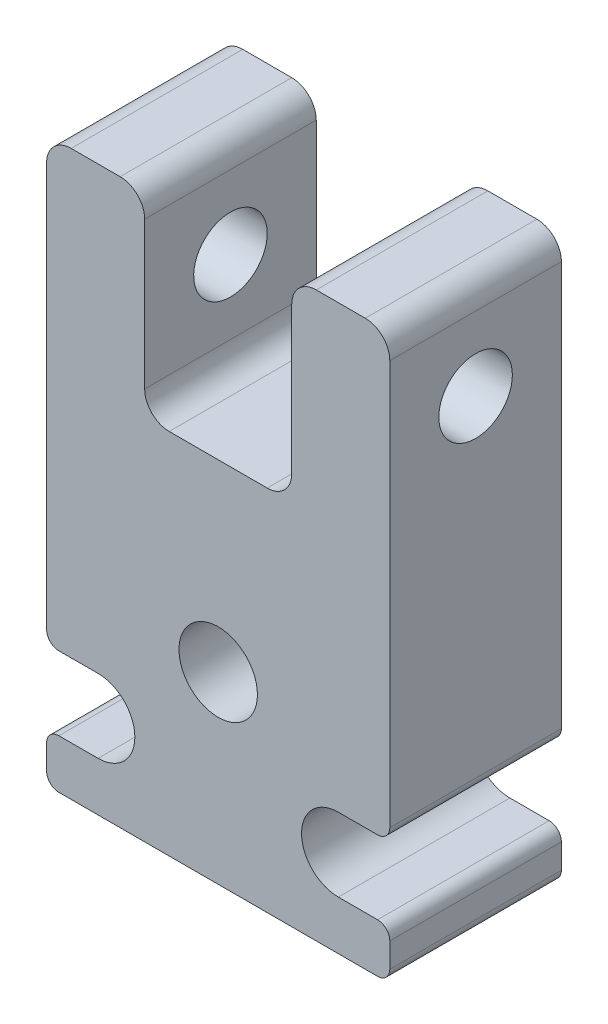
ISO-10303-21;
HEADER;
FILE_DESCRIPTION(('STEP AP214'),'2;1');
FILE_NAME('part.step','',(''),(''),'','','');
FILE_SCHEMA(('AUTOMOTIVE_DESIGN { 1 0 10303 214 1 1 1 1 }'));
ENDSEC;
DATA;
#1=APPLICATION_CONTEXT('core data for automotive mechanical design processes');
#2=APPLICATION_PROTOCOL_DEFINITION('international standard','automotive_design',2000,#1);
#3=PRODUCT_CONTEXT('',#1,'mechanical');
#4=PRODUCT('Part','Part','',(#3));
#5=PRODUCT_RELATED_PRODUCT_CATEGORY('part','',(#4));
#6=PRODUCT_DEFINITION_FORMATION('','',#4);
#7=PRODUCT_DEFINITION_CONTEXT('part definition',#1,'design');
#8=PRODUCT_DEFINITION('design','',#6,#7);
#9=PRODUCT_DEFINITION_SHAPE('','',#8);
#10=(LENGTH_UNIT() NAMED_UNIT(*) SI_UNIT(.MILLI.,.METRE.));
#11=(NAMED_UNIT(*) PLANE_ANGLE_UNIT() SI_UNIT($,.RADIAN.));
#12=(NAMED_UNIT(*) SI_UNIT($,.STERADIAN.) SOLID_ANGLE_UNIT());
#13=UNCERTAINTY_MEASURE_WITH_UNIT(LENGTH_MEASURE(1.E-05),#10,'distance_accuracy_value','');
#14=(GEOMETRIC_REPRESENTATION_CONTEXT(3) GLOBAL_UNCERTAINTY_ASSIGNED_CONTEXT((#13)) GLOBAL_UNIT_ASSIGNED_CONTEXT((#10,
#11,#12)) REPRESENTATION_CONTEXT('',''));
#15=CARTESIAN_POINT('',(0.,0.,0.));
#16=DIRECTION('',(0.,0.,1.));
#17=DIRECTION('',(1.,0.,0.));
#18=AXIS2_PLACEMENT_3D('',#15,#16,#17);
#19=CARTESIAN_POINT('',(-4.9,-8.00000000000001,3.5));
#20=DIRECTION('',(0.,0.,1.));
#21=DIRECTION('',(1.,0.,0.));
#22=AXIS2_PLACEMENT_3D('',#19,#20,#21);
#23=PLANE('',#22);
#24=DIRECTION('',(1.,0.,0.));
#25=VECTOR('',#24,1.);
#26=CARTESIAN_POINT('',(-7.,-11.5,3.5));
#27=LINE('',#26,#25);
#28=CARTESIAN_POINT('',(-6.5,-11.5,3.5));
#29=VERTEX_POINT('',#28);
#30=CARTESIAN_POINT('',(6.5,-11.5,3.5));
#31=VERTEX_POINT('',#30);
#32=EDGE_CURVE('E279',#29,#31,#27,.T.);
#33=ORIENTED_EDGE('',*,*,#32,.T.);
#34=CARTESIAN_POINT('',(6.5,-11.,3.5));
#35=DIRECTION('',(0.,0.,1.));
#36=DIRECTION('',(1.,0.,0.));
#37=AXIS2_PLACEMENT_3D('',#34,#35,#36);
#38=CIRCLE('',#37,0.5);
#39=CARTESIAN_POINT('',(7.,-11.,3.5));
#40=VERTEX_POINT('',#39);
#41=EDGE_CURVE('E415',#31,#40,#38,.T.);
#42=ORIENTED_EDGE('',*,*,#41,.T.);
#43=DIRECTION('',(0.,1.,0.));
#44=VECTOR('',#43,1.);
#45=CARTESIAN_POINT('',(7.,-9.50000000000001,3.5));
#46=LINE('',#45,#44);
#47=CARTESIAN_POINT('',(7.,-10.,3.5));
#48=VERTEX_POINT('',#47);
#49=EDGE_CURVE('E230',#40,#48,#46,.T.);
#50=ORIENTED_EDGE('',*,*,#49,.T.);
#51=CARTESIAN_POINT('',(6.5,-10.,3.5));
#52=DIRECTION('',(0.,0.,1.));
#53=DIRECTION('',(1.,0.,0.));
#54=AXIS2_PLACEMENT_3D('',#51,#52,#53);
#55=CIRCLE('',#54,0.5);
#56=CARTESIAN_POINT('',(6.5,-9.50000000000001,3.5));
#57=VERTEX_POINT('',#56);
#58=EDGE_CURVE('E226',#48,#57,#55,.T.);
#59=ORIENTED_EDGE('',*,*,#58,.T.);
#60=DIRECTION('',(-1.,0.,0.));
#61=VECTOR('',#60,1.);
#62=CARTESIAN_POINT('',(4.9,-9.50000000000001,3.5));
#63=LINE('',#62,#61);
#64=CARTESIAN_POINT('',(4.9,-9.50000000000001,3.5));
#65=VERTEX_POINT('',#64);
#66=EDGE_CURVE('E217',#57,#65,#63,.T.);
#67=ORIENTED_EDGE('',*,*,#66,.T.);
#68=CARTESIAN_POINT('',(4.9,-8.,3.5));
#69=DIRECTION('',(0.,0.,-1.));
#70=DIRECTION('',(1.,0.,0.));
#71=AXIS2_PLACEMENT_3D('',#68,#69,#70);
#72=CIRCLE('',#71,1.5);
#73=CARTESIAN_POINT('',(4.9,-6.5,3.5));
#74=VERTEX_POINT('',#73);
#75=EDGE_CURVE('E222',#65,#74,#72,.T.);
#76=ORIENTED_EDGE('',*,*,#75,.T.);
#77=DIRECTION('',(1.,0.,0.));
#78=VECTOR('',#77,1.);
#79=CARTESIAN_POINT('',(4.9,-6.5,3.5));
#80=LINE('',#79,#78);
#81=CARTESIAN_POINT('',(6.5,-6.50000000000001,3.5));
#82=VERTEX_POINT('',#81);
#83=EDGE_CURVE('E244',#74,#82,#80,.T.);
#84=ORIENTED_EDGE('',*,*,#83,.T.);
#85=CARTESIAN_POINT('',(6.5,-6.00000000000001,3.5));
#86=DIRECTION('',(0.,0.,1.));
#87=DIRECTION('',(1.,0.,0.));
#88=AXIS2_PLACEMENT_3D('',#85,#86,#87);
#89=CIRCLE('',#88,0.5);
#90=CARTESIAN_POINT('',(7.,-6.00000000000001,3.5));
#91=VERTEX_POINT('',#90);
#92=EDGE_CURVE('E48',#82,#91,#89,.T.);
#93=ORIENTED_EDGE('',*,*,#92,.T.);
#94=DIRECTION('',(0.,1.,0.));
#95=VECTOR('',#94,1.);
#96=CARTESIAN_POINT('',(7.,11.5,3.5));
#97=LINE('',#96,#95);
#98=CARTESIAN_POINT('',(7.,10.5,3.5));
#99=VERTEX_POINT('',#98);
#100=EDGE_CURVE('E246',#91,#99,#97,.T.);
#101=ORIENTED_EDGE('',*,*,#100,.T.);
#102=CARTESIAN_POINT('',(6.,10.5,3.5));
#103=DIRECTION('',(0.,0.,1.));
#104=DIRECTION('',(1.,0.,0.));
#105=AXIS2_PLACEMENT_3D('',#102,#103,#104);
#106=CIRCLE('',#105,1.);
#107=CARTESIAN_POINT('',(6.,11.5,3.5));
#108=VERTEX_POINT('',#107);
#109=EDGE_CURVE('E346',#99,#108,#106,.T.);
#110=ORIENTED_EDGE('',*,*,#109,.T.);
#111=DIRECTION('',(-1.,0.,0.));
#112=VECTOR('',#111,1.);
#113=CARTESIAN_POINT('',(3.,11.5,3.5));
#114=LINE('',#113,#112);
#115=CARTESIAN_POINT('',(4.,11.5,3.5));
#116=VERTEX_POINT('',#115);
#117=EDGE_CURVE('E251',#108,#116,#114,.T.);
#118=ORIENTED_EDGE('',*,*,#117,.T.);
#119=CARTESIAN_POINT('',(4.,10.5,3.5));
#120=DIRECTION('',(0.,0.,1.));
#121=DIRECTION('',(1.,0.,0.));
#122=AXIS2_PLACEMENT_3D('',#119,#120,#121);
#123=CIRCLE('',#122,1.);
#124=CARTESIAN_POINT('',(3.,10.5,3.5));
#125=VERTEX_POINT('',#124);
#126=EDGE_CURVE('E348',#116,#125,#123,.T.);
#127=ORIENTED_EDGE('',*,*,#126,.T.);
#128=DIRECTION('',(0.,-1.,0.));
#129=VECTOR('',#128,1.);
#130=CARTESIAN_POINT('',(3.,11.5,3.5));
#131=LINE('',#130,#129);
#132=CARTESIAN_POINT('',(3.,4.5,3.5));
#133=VERTEX_POINT('',#132);
#134=EDGE_CURVE('E254',#125,#133,#131,.T.);
#135=ORIENTED_EDGE('',*,*,#134,.T.);
#136=CARTESIAN_POINT('',(2.,4.5,3.5));
#137=DIRECTION('',(0.,0.,1.));
#138=DIRECTION('',(1.,0.,0.));
#139=AXIS2_PLACEMENT_3D('',#136,#137,#138);
#140=CIRCLE('',#139,1.);
#141=CARTESIAN_POINT('',(2.,3.5,3.5));
#142=VERTEX_POINT('',#141);
#143=EDGE_CURVE('E383',#133,#142,#140,.F.);
#144=ORIENTED_EDGE('',*,*,#143,.T.);
#145=DIRECTION('',(-1.,0.,0.));
#146=VECTOR('',#145,1.);
#147=CARTESIAN_POINT('',(-3.,3.5,3.5));
#148=LINE('',#147,#146);
#149=CARTESIAN_POINT('',(-2.,3.5,3.5));
#150=VERTEX_POINT('',#149);
#151=EDGE_CURVE('E257',#142,#150,#148,.T.);
#152=ORIENTED_EDGE('',*,*,#151,.T.);
#153=CARTESIAN_POINT('',(-2.,4.5,3.5));
#154=DIRECTION('',(0.,0.,1.));
#155=DIRECTION('',(1.,0.,0.));
#156=AXIS2_PLACEMENT_3D('',#153,#154,#155);
#157=CIRCLE('',#156,1.);
#158=CARTESIAN_POINT('',(-3.,4.5,3.5));
#159=VERTEX_POINT('',#158);
#160=EDGE_CURVE('E379',#150,#159,#157,.F.);
#161=ORIENTED_EDGE('',*,*,#160,.T.);
#162=DIRECTION('',(0.,1.,0.));
#163=VECTOR('',#162,1.);
#164=CARTESIAN_POINT('',(-3.,11.5,3.5));
#165=LINE('',#164,#163);
#166=CARTESIAN_POINT('',(-3.,10.5,3.5));
#167=VERTEX_POINT('',#166);
#168=EDGE_CURVE('E260',#159,#167,#165,.T.);
#169=ORIENTED_EDGE('',*,*,#168,.T.);
#170=CARTESIAN_POINT('',(-4.,10.5,3.5));
#171=DIRECTION('',(0.,0.,1.));
#172=DIRECTION('',(1.,0.,0.));
#173=AXIS2_PLACEMENT_3D('',#170,#171,#172);
#174=CIRCLE('',#173,1.);
#175=CARTESIAN_POINT('',(-4.,11.5,3.5));
#176=VERTEX_POINT('',#175);
#177=EDGE_CURVE('E350',#167,#176,#174,.T.);
#178=ORIENTED_EDGE('',*,*,#177,.T.);
#179=DIRECTION('',(-1.,0.,0.));
#180=VECTOR('',#179,1.);
#181=CARTESIAN_POINT('',(-7.,11.5,3.5));
#182=LINE('',#181,#180);
#183=CARTESIAN_POINT('',(-6.,11.5,3.5));
#184=VERTEX_POINT('',#183);
#185=EDGE_CURVE('E263',#176,#184,#182,.T.);
#186=ORIENTED_EDGE('',*,*,#185,.T.);
#187=CARTESIAN_POINT('',(-6.,10.5,3.5));
#188=DIRECTION('',(0.,0.,1.));
#189=DIRECTION('',(1.,0.,0.));
#190=AXIS2_PLACEMENT_3D('',#187,#188,#189);
#191=CIRCLE('',#190,1.);
#192=CARTESIAN_POINT('',(-7.,10.5,3.5));
#193=VERTEX_POINT('',#192);
#194=EDGE_CURVE('E352',#184,#193,#191,.T.);
#195=ORIENTED_EDGE('',*,*,#194,.T.);
#196=DIRECTION('',(0.,-1.,0.));
#197=VECTOR('',#196,1.);
#198=CARTESIAN_POINT('',(-7.,11.5,3.5));
#199=LINE('',#198,#197);
#200=CARTESIAN_POINT('',(-7.,-6.00000000000001,3.5));
#201=VERTEX_POINT('',#200);
#202=EDGE_CURVE('E266',#193,#201,#199,.T.);
#203=ORIENTED_EDGE('',*,*,#202,.T.);
#204=CARTESIAN_POINT('',(-6.5,-6.00000000000001,3.5));
#205=DIRECTION('',(0.,0.,1.));
#206=DIRECTION('',(1.,0.,0.));
#207=AXIS2_PLACEMENT_3D('',#204,#205,#206);
#208=CIRCLE('',#207,0.5);
#209=CARTESIAN_POINT('',(-6.5,-6.50000000000001,3.5));
#210=VERTEX_POINT('',#209);
#211=EDGE_CURVE('E407',#201,#210,#208,.T.);
#212=ORIENTED_EDGE('',*,*,#211,.T.);
#213=DIRECTION('',(1.,0.,0.));
#214=VECTOR('',#213,1.);
#215=CARTESIAN_POINT('',(-4.9,-6.5,3.5));
#216=LINE('',#215,#214);
#217=CARTESIAN_POINT('',(-4.9,-6.5,3.5));
#218=VERTEX_POINT('',#217);
#219=EDGE_CURVE('E269',#210,#218,#216,.T.);
#220=ORIENTED_EDGE('',*,*,#219,.T.);
#221=CARTESIAN_POINT('',(-4.9,-8.00000000000001,3.5));
#222=DIRECTION('',(0.,0.,-1.));
#223=DIRECTION('',(1.,0.,0.));
#224=AXIS2_PLACEMENT_3D('',#221,#222,#223);
#225=CIRCLE('',#224,1.5);
#226=CARTESIAN_POINT('',(-4.9,-9.50000000000001,3.5));
#227=VERTEX_POINT('',#226);
#228=EDGE_CURVE('E271',#218,#227,#225,.T.);
#229=ORIENTED_EDGE('',*,*,#228,.T.);
#230=DIRECTION('',(-1.,0.,0.));
#231=VECTOR('',#230,1.);
#232=CARTESIAN_POINT('',(-4.9,-9.50000000000001,3.5));
#233=LINE('',#232,#231);
#234=CARTESIAN_POINT('',(-6.5,-9.50000000000001,3.5));
#235=VERTEX_POINT('',#234);
#236=EDGE_CURVE('E273',#227,#235,#233,.T.);
#237=ORIENTED_EDGE('',*,*,#236,.T.);
#238=CARTESIAN_POINT('',(-6.5,-10.,3.5));
#239=DIRECTION('',(0.,0.,1.));
#240=DIRECTION('',(1.,0.,0.));
#241=AXIS2_PLACEMENT_3D('',#238,#239,#240);
#242=CIRCLE('',#241,0.5);
#243=CARTESIAN_POINT('',(-7.,-10.,3.5));
#244=VERTEX_POINT('',#243);
#245=EDGE_CURVE('E409',#235,#244,#242,.T.);
#246=ORIENTED_EDGE('',*,*,#245,.T.);
#247=DIRECTION('',(0.,-1.,0.));
#248=VECTOR('',#247,1.);
#249=CARTESIAN_POINT('',(-7.,-9.50000000000001,3.5));
#250=LINE('',#249,#248);
#251=CARTESIAN_POINT('',(-7.,-11.,3.5));
#252=VERTEX_POINT('',#251);
#253=EDGE_CURVE('E276',#244,#252,#250,.T.);
#254=ORIENTED_EDGE('',*,*,#253,.T.);
#255=CARTESIAN_POINT('',(-6.5,-11.,3.5));
#256=DIRECTION('',(0.,0.,1.));
#257=DIRECTION('',(1.,0.,0.));
#258=AXIS2_PLACEMENT_3D('',#255,#256,#257);
#259=CIRCLE('',#258,0.5);
#260=EDGE_CURVE('E413',#252,#29,#259,.T.);
#261=ORIENTED_EDGE('',*,*,#260,.T.);
#262=EDGE_LOOP('',(#33,#42,#50,#59,#67,#76,#84,#93,#101,#110,#118,#127,#135,#144,#152,#161,#169,
#178,#186,#195,#203,#212,#220,#229,#237,#246,#254,#261));
#263=FACE_BOUND('',#262,.T.);
#264=CARTESIAN_POINT('',(0.,-4.,3.5));
#265=DIRECTION('',(0.,0.,1.));
#266=DIRECTION('',(1.,0.,0.));
#267=AXIS2_PLACEMENT_3D('',#264,#265,#266);
#268=CIRCLE('',#267,1.6);
#269=CARTESIAN_POINT('',(1.6,-4.,3.5));
#270=VERTEX_POINT('',#269);
#271=EDGE_CURVE('E285',#270,#270,#268,.T.);
#272=ORIENTED_EDGE('',*,*,#271,.F.);
#273=EDGE_LOOP('',(#272));
#274=FACE_BOUND('',#273,.T.);
#275=ADVANCED_FACE('F33',(#263,#274),#23,.T.);
#276=CARTESIAN_POINT('',(-4.9,-8.00000000000001,-3.5));
#277=DIRECTION('',(0.,0.,1.));
#278=DIRECTION('',(1.,0.,0.));
#279=AXIS2_PLACEMENT_3D('',#276,#277,#278);
#280=PLANE('',#279);
#281=DIRECTION('',(0.,1.,0.));
#282=VECTOR('',#281,1.);
#283=CARTESIAN_POINT('',(7.,-9.50000000000001,-3.5));
#284=LINE('',#283,#282);
#285=CARTESIAN_POINT('',(7.,-11.,-3.5));
#286=VERTEX_POINT('',#285);
#287=CARTESIAN_POINT('',(7.,-10.,-3.5));
#288=VERTEX_POINT('',#287);
#289=EDGE_CURVE('E282',#286,#288,#284,.T.);
#290=ORIENTED_EDGE('',*,*,#289,.F.);
#291=CARTESIAN_POINT('',(6.5,-11.,-3.5));
#292=DIRECTION('',(0.,0.,1.));
#293=DIRECTION('',(1.,0.,0.));
#294=AXIS2_PLACEMENT_3D('',#291,#292,#293);
#295=CIRCLE('',#294,0.5);
#296=CARTESIAN_POINT('',(6.5,-11.5,-3.5));
#297=VERTEX_POINT('',#296);
#298=EDGE_CURVE('E400',#286,#297,#295,.F.);
#299=ORIENTED_EDGE('',*,*,#298,.T.);
#300=DIRECTION('',(1.,0.,0.));
#301=VECTOR('',#300,1.);
#302=CARTESIAN_POINT('',(-7.,-11.5,-3.5));
#303=LINE('',#302,#301);
#304=CARTESIAN_POINT('',(-6.5,-11.5,-3.5));
#305=VERTEX_POINT('',#304);
#306=EDGE_CURVE('E321',#305,#297,#303,.T.);
#307=ORIENTED_EDGE('',*,*,#306,.F.);
#308=CARTESIAN_POINT('',(-6.5,-11.,-3.5));
#309=DIRECTION('',(0.,0.,1.));
#310=DIRECTION('',(1.,0.,0.));
#311=AXIS2_PLACEMENT_3D('',#308,#309,#310);
#312=CIRCLE('',#311,0.5);
#313=CARTESIAN_POINT('',(-7.,-11.,-3.5));
#314=VERTEX_POINT('',#313);
#315=EDGE_CURVE('E398',#305,#314,#312,.F.);
#316=ORIENTED_EDGE('',*,*,#315,.T.);
#317=DIRECTION('',(0.,-1.,0.));
#318=VECTOR('',#317,1.);
#319=CARTESIAN_POINT('',(-7.,-9.50000000000001,-3.5));
#320=LINE('',#319,#318);
#321=CARTESIAN_POINT('',(-7.,-10.,-3.5));
#322=VERTEX_POINT('',#321);
#323=EDGE_CURVE('E318',#322,#314,#320,.T.);
#324=ORIENTED_EDGE('',*,*,#323,.F.);
#325=CARTESIAN_POINT('',(-6.5,-10.,-3.5));
#326=DIRECTION('',(0.,0.,1.));
#327=DIRECTION('',(1.,0.,0.));
#328=AXIS2_PLACEMENT_3D('',#325,#326,#327);
#329=CIRCLE('',#328,0.5);
#330=CARTESIAN_POINT('',(-6.5,-9.50000000000001,-3.5));
#331=VERTEX_POINT('',#330);
#332=EDGE_CURVE('E392',#322,#331,#329,.F.);
#333=ORIENTED_EDGE('',*,*,#332,.T.);
#334=DIRECTION('',(-1.,0.,0.));
#335=VECTOR('',#334,1.);
#336=CARTESIAN_POINT('',(-4.9,-9.50000000000001,-3.5));
#337=LINE('',#336,#335);
#338=CARTESIAN_POINT('',(-4.9,-9.50000000000001,-3.5));
#339=VERTEX_POINT('',#338);
#340=EDGE_CURVE('E315',#339,#331,#337,.T.);
#341=ORIENTED_EDGE('',*,*,#340,.F.);
#342=CARTESIAN_POINT('',(-4.9,-8.00000000000001,-3.5));
#343=DIRECTION('',(0.,0.,-1.));
#344=DIRECTION('',(1.,0.,0.));
#345=AXIS2_PLACEMENT_3D('',#342,#343,#344);
#346=CIRCLE('',#345,1.5);
#347=CARTESIAN_POINT('',(-4.9,-6.5,-3.5));
#348=VERTEX_POINT('',#347);
#349=EDGE_CURVE('E313',#348,#339,#346,.T.);
#350=ORIENTED_EDGE('',*,*,#349,.F.);
#351=DIRECTION('',(1.,0.,0.));
#352=VECTOR('',#351,1.);
#353=CARTESIAN_POINT('',(-4.9,-6.5,-3.5));
#354=LINE('',#353,#352);
#355=CARTESIAN_POINT('',(-6.5,-6.50000000000001,-3.5));
#356=VERTEX_POINT('',#355);
#357=EDGE_CURVE('E311',#356,#348,#354,.T.);
#358=ORIENTED_EDGE('',*,*,#357,.F.);
#359=CARTESIAN_POINT('',(-6.5,-6.00000000000001,-3.5));
#360=DIRECTION('',(0.,0.,1.));
#361=DIRECTION('',(1.,0.,0.));
#362=AXIS2_PLACEMENT_3D('',#359,#360,#361);
#363=CIRCLE('',#362,0.5);
#364=CARTESIAN_POINT('',(-7.,-6.00000000000001,-3.5));
#365=VERTEX_POINT('',#364);
#366=EDGE_CURVE('E390',#356,#365,#363,.F.);
#367=ORIENTED_EDGE('',*,*,#366,.T.);
#368=DIRECTION('',(0.,-1.,0.));
#369=VECTOR('',#368,1.);
#370=CARTESIAN_POINT('',(-7.,11.5,-3.5));
#371=LINE('',#370,#369);
#372=CARTESIAN_POINT('',(-7.,10.5,-3.5));
#373=VERTEX_POINT('',#372);
#374=EDGE_CURVE('E308',#373,#365,#371,.T.);
#375=ORIENTED_EDGE('',*,*,#374,.F.);
#376=CARTESIAN_POINT('',(-6.,10.5,-3.5));
#377=DIRECTION('',(0.,0.,1.));
#378=DIRECTION('',(1.,0.,0.));
#379=AXIS2_PLACEMENT_3D('',#376,#377,#378);
#380=CIRCLE('',#379,1.);
#381=CARTESIAN_POINT('',(-6.,11.5,-3.5));
#382=VERTEX_POINT('',#381);
#383=EDGE_CURVE('E339',#373,#382,#380,.F.);
#384=ORIENTED_EDGE('',*,*,#383,.T.);
#385=DIRECTION('',(-1.,0.,0.));
#386=VECTOR('',#385,1.);
#387=CARTESIAN_POINT('',(-7.,11.5,-3.5));
#388=LINE('',#387,#386);
#389=CARTESIAN_POINT('',(-4.,11.5,-3.5));
#390=VERTEX_POINT('',#389);
#391=EDGE_CURVE('E305',#390,#382,#388,.T.);
#392=ORIENTED_EDGE('',*,*,#391,.F.);
#393=CARTESIAN_POINT('',(-4.,10.5,-3.5));
#394=DIRECTION('',(0.,0.,1.));
#395=DIRECTION('',(1.,0.,0.));
#396=AXIS2_PLACEMENT_3D('',#393,#394,#395);
#397=CIRCLE('',#396,1.);
#398=CARTESIAN_POINT('',(-3.,10.5,-3.5));
#399=VERTEX_POINT('',#398);
#400=EDGE_CURVE('E337',#390,#399,#397,.F.);
#401=ORIENTED_EDGE('',*,*,#400,.T.);
#402=DIRECTION('',(0.,1.,0.));
#403=VECTOR('',#402,1.);
#404=CARTESIAN_POINT('',(-3.,11.5,-3.5));
#405=LINE('',#404,#403);
#406=CARTESIAN_POINT('',(-3.,4.5,-3.5));
#407=VERTEX_POINT('',#406);
#408=EDGE_CURVE('E302',#407,#399,#405,.T.);
#409=ORIENTED_EDGE('',*,*,#408,.F.);
#410=CARTESIAN_POINT('',(-2.,4.5,-3.5));
#411=DIRECTION('',(0.,0.,1.));
#412=DIRECTION('',(1.,0.,0.));
#413=AXIS2_PLACEMENT_3D('',#410,#411,#412);
#414=CIRCLE('',#413,1.);
#415=CARTESIAN_POINT('',(-2.,3.5,-3.5));
#416=VERTEX_POINT('',#415);
#417=EDGE_CURVE('E377',#407,#416,#414,.T.);
#418=ORIENTED_EDGE('',*,*,#417,.T.);
#419=DIRECTION('',(-1.,0.,0.));
#420=VECTOR('',#419,1.);
#421=CARTESIAN_POINT('',(-3.,3.5,-3.5));
#422=LINE('',#421,#420);
#423=CARTESIAN_POINT('',(2.,3.5,-3.5));
#424=VERTEX_POINT('',#423);
#425=EDGE_CURVE('E299',#424,#416,#422,.T.);
#426=ORIENTED_EDGE('',*,*,#425,.F.);
#427=CARTESIAN_POINT('',(2.,4.5,-3.5));
#428=DIRECTION('',(0.,0.,1.));
#429=DIRECTION('',(1.,0.,0.));
#430=AXIS2_PLACEMENT_3D('',#427,#428,#429);
#431=CIRCLE('',#430,1.);
#432=CARTESIAN_POINT('',(3.,4.5,-3.5));
#433=VERTEX_POINT('',#432);
#434=EDGE_CURVE('E381',#424,#433,#431,.T.);
#435=ORIENTED_EDGE('',*,*,#434,.T.);
#436=DIRECTION('',(0.,-1.,0.));
#437=VECTOR('',#436,1.);
#438=CARTESIAN_POINT('',(3.,11.5,-3.5));
#439=LINE('',#438,#437);
#440=CARTESIAN_POINT('',(3.,10.5,-3.5));
#441=VERTEX_POINT('',#440);
#442=EDGE_CURVE('E296',#441,#433,#439,.T.);
#443=ORIENTED_EDGE('',*,*,#442,.F.);
#444=CARTESIAN_POINT('',(4.,10.5,-3.5));
#445=DIRECTION('',(0.,0.,1.));
#446=DIRECTION('',(1.,0.,0.));
#447=AXIS2_PLACEMENT_3D('',#444,#445,#446);
#448=CIRCLE('',#447,1.);
#449=CARTESIAN_POINT('',(4.,11.5,-3.5));
#450=VERTEX_POINT('',#449);
#451=EDGE_CURVE('E335',#441,#450,#448,.F.);
#452=ORIENTED_EDGE('',*,*,#451,.T.);
#453=DIRECTION('',(-1.,0.,0.));
#454=VECTOR('',#453,1.);
#455=CARTESIAN_POINT('',(3.,11.5,-3.5));
#456=LINE('',#455,#454);
#457=CARTESIAN_POINT('',(6.,11.5,-3.5));
#458=VERTEX_POINT('',#457);
#459=EDGE_CURVE('E293',#458,#450,#456,.T.);
#460=ORIENTED_EDGE('',*,*,#459,.F.);
#461=CARTESIAN_POINT('',(6.,10.5,-3.5));
#462=DIRECTION('',(0.,0.,1.));
#463=DIRECTION('',(1.,0.,0.));
#464=AXIS2_PLACEMENT_3D('',#461,#462,#463);
#465=CIRCLE('',#464,1.);
#466=CARTESIAN_POINT('',(7.,10.5,-3.5));
#467=VERTEX_POINT('',#466);
#468=EDGE_CURVE('E332',#458,#467,#465,.F.);
#469=ORIENTED_EDGE('',*,*,#468,.T.);
#470=DIRECTION('',(0.,1.,0.));
#471=VECTOR('',#470,1.);
#472=CARTESIAN_POINT('',(7.,11.5,-3.5));
#473=LINE('',#472,#471);
#474=CARTESIAN_POINT('',(7.,-6.00000000000001,-3.5));
#475=VERTEX_POINT('',#474);
#476=EDGE_CURVE('E291',#475,#467,#473,.T.);
#477=ORIENTED_EDGE('',*,*,#476,.F.);
#478=CARTESIAN_POINT('',(6.5,-6.00000000000001,-3.5));
#479=DIRECTION('',(0.,0.,1.));
#480=DIRECTION('',(1.,0.,0.));
#481=AXIS2_PLACEMENT_3D('',#478,#479,#480);
#482=CIRCLE('',#481,0.5);
#483=CARTESIAN_POINT('',(6.5,-6.50000000000001,-3.5));
#484=VERTEX_POINT('',#483);
#485=EDGE_CURVE('E394',#475,#484,#482,.F.);
#486=ORIENTED_EDGE('',*,*,#485,.T.);
#487=DIRECTION('',(1.,0.,0.));
#488=VECTOR('',#487,1.);
#489=CARTESIAN_POINT('',(4.9,-6.5,-3.5));
#490=LINE('',#489,#488);
#491=CARTESIAN_POINT('',(4.9,-6.5,-3.5));
#492=VERTEX_POINT('',#491);
#493=EDGE_CURVE('E289',#492,#484,#490,.T.);
#494=ORIENTED_EDGE('',*,*,#493,.F.);
#495=CARTESIAN_POINT('',(4.9,-8.,-3.5));
#496=DIRECTION('',(0.,0.,-1.));
#497=DIRECTION('',(1.,0.,0.));
#498=AXIS2_PLACEMENT_3D('',#495,#496,#497);
#499=CIRCLE('',#498,1.5);
#500=CARTESIAN_POINT('',(4.9,-9.50000000000001,-3.5));
#501=VERTEX_POINT('',#500);
#502=EDGE_CURVE('E287',#501,#492,#499,.T.);
#503=ORIENTED_EDGE('',*,*,#502,.F.);
#504=DIRECTION('',(-1.,0.,0.));
#505=VECTOR('',#504,1.);
#506=CARTESIAN_POINT('',(4.9,-9.50000000000001,-3.5));
#507=LINE('',#506,#505);
#508=CARTESIAN_POINT('',(6.5,-9.50000000000001,-3.5));
#509=VERTEX_POINT('',#508);
#510=EDGE_CURVE('E236',#509,#501,#507,.T.);
#511=ORIENTED_EDGE('',*,*,#510,.F.);
#512=CARTESIAN_POINT('',(6.5,-10.,-3.5));
#513=DIRECTION('',(0.,0.,1.));
#514=DIRECTION('',(1.,0.,0.));
#515=AXIS2_PLACEMENT_3D('',#512,#513,#514);
#516=CIRCLE('',#515,0.5);
#517=EDGE_CURVE('E396',#509,#288,#516,.F.);
#518=ORIENTED_EDGE('',*,*,#517,.T.);
#519=EDGE_LOOP('',(#290,#299,#307,#316,#324,#333,#341,#350,#358,#367,#375,#384,#392,#401,#409,
#418,#426,#435,#443,#452,#460,#469,#477,#486,#494,#503,#511,#518));
#520=FACE_BOUND('',#519,.T.);
#521=CARTESIAN_POINT('',(0.,-4.,-3.5));
#522=DIRECTION('',(0.,0.,1.));
#523=DIRECTION('',(1.,0.,0.));
#524=AXIS2_PLACEMENT_3D('',#521,#522,#523);
#525=CIRCLE('',#524,1.6);
#526=CARTESIAN_POINT('',(1.6,-4.,-3.5));
#527=VERTEX_POINT('',#526);
#528=EDGE_CURVE('E482',#527,#527,#525,.T.);
#529=ORIENTED_EDGE('',*,*,#528,.T.);
#530=EDGE_LOOP('',(#529));
#531=FACE_BOUND('',#530,.T.);
#532=ADVANCED_FACE('F441',(#520,#531),#280,.F.);
#533=CARTESIAN_POINT('',(7.,-9.50000000000001,3.5));
#534=DIRECTION('',(-1.,0.,0.));
#535=DIRECTION('',(0.,-1.,0.));
#536=AXIS2_PLACEMENT_3D('',#533,#534,#535);
#537=PLANE('',#536);
#538=ORIENTED_EDGE('',*,*,#49,.F.);
#539=DIRECTION('',(0.,0.,-1.));
#540=VECTOR('',#539,1.);
#541=CARTESIAN_POINT('',(7.,-11.,3.5));
#542=LINE('',#541,#540);
#543=EDGE_CURVE('E387',#40,#286,#542,.T.);
#544=ORIENTED_EDGE('',*,*,#543,.T.);
#545=ORIENTED_EDGE('',*,*,#289,.T.);
#546=DIRECTION('',(0.,0.,-1.));
#547=VECTOR('',#546,1.);
#548=CARTESIAN_POINT('',(7.,-10.,3.5));
#549=LINE('',#548,#547);
#550=EDGE_CURVE('E385',#288,#48,#549,.F.);
#551=ORIENTED_EDGE('',*,*,#550,.T.);
#552=EDGE_LOOP('',(#538,#544,#545,#551));
#553=FACE_BOUND('',#552,.T.);
#554=ADVANCED_FACE('F477',(#553),#537,.F.);
#555=CARTESIAN_POINT('',(4.9,-9.50000000000001,3.5));
#556=DIRECTION('',(0.,-1.,0.));
#557=DIRECTION('',(1.,0.,0.));
#558=AXIS2_PLACEMENT_3D('',#555,#556,#557);
#559=PLANE('',#558);
#560=ORIENTED_EDGE('',*,*,#66,.F.);
#561=DIRECTION('',(0.,0.,-1.));
#562=VECTOR('',#561,1.);
#563=CARTESIAN_POINT('',(6.5,-9.50000000000001,3.5));
#564=LINE('',#563,#562);
#565=EDGE_CURVE('E422',#57,#509,#564,.T.);
#566=ORIENTED_EDGE('',*,*,#565,.T.);
#567=ORIENTED_EDGE('',*,*,#510,.T.);
#568=DIRECTION('',(0.,0.,-1.));
#569=VECTOR('',#568,1.);
#570=CARTESIAN_POINT('',(4.9,-9.50000000000001,3.5));
#571=LINE('',#570,#569);
#572=EDGE_CURVE('E233',#65,#501,#571,.T.);
#573=ORIENTED_EDGE('',*,*,#572,.F.);
#574=EDGE_LOOP('',(#560,#566,#567,#573));
#575=FACE_BOUND('',#574,.T.);
#576=ADVANCED_FACE('F234',(#575),#559,.F.);
#577=CARTESIAN_POINT('',(4.9,-8.,3.5));
#578=DIRECTION('',(0.,0.,-1.));
#579=DIRECTION('',(-1.,0.,0.));
#580=AXIS2_PLACEMENT_3D('',#577,#578,#579);
#581=CYLINDRICAL_SURFACE('',#580,1.5);
#582=ORIENTED_EDGE('',*,*,#502,.T.);
#583=DIRECTION('',(0.,0.,-1.));
#584=VECTOR('',#583,1.);
#585=CARTESIAN_POINT('',(4.9,-6.5,3.5));
#586=LINE('',#585,#584);
#587=EDGE_CURVE('E240',#74,#492,#586,.T.);
#588=ORIENTED_EDGE('',*,*,#587,.F.);
#589=ORIENTED_EDGE('',*,*,#75,.F.);
#590=ORIENTED_EDGE('',*,*,#572,.T.);
#591=EDGE_LOOP('',(#582,#588,#589,#590));
#592=FACE_BOUND('',#591,.T.);
#593=ADVANCED_FACE('F242',(#592),#581,.F.);
#594=CARTESIAN_POINT('',(4.9,-6.5,3.5));
#595=DIRECTION('',(0.,1.,0.));
#596=DIRECTION('',(-1.,0.,0.));
#597=AXIS2_PLACEMENT_3D('',#594,#595,#596);
#598=PLANE('',#597);
#599=ORIENTED_EDGE('',*,*,#493,.T.);
#600=DIRECTION('',(0.,0.,-1.));
#601=VECTOR('',#600,1.);
#602=CARTESIAN_POINT('',(6.5,-6.50000000000001,3.5));
#603=LINE('',#602,#601);
#604=EDGE_CURVE('E56',#484,#82,#603,.F.);
#605=ORIENTED_EDGE('',*,*,#604,.T.);
#606=ORIENTED_EDGE('',*,*,#83,.F.);
#607=ORIENTED_EDGE('',*,*,#587,.T.);
#608=EDGE_LOOP('',(#599,#605,#606,#607));
#609=FACE_BOUND('',#608,.T.);
#610=ADVANCED_FACE('F507',(#609),#598,.F.);
#611=CARTESIAN_POINT('',(7.,11.5,3.5));
#612=DIRECTION('',(-1.,0.,0.));
#613=DIRECTION('',(0.,-1.,0.));
#614=AXIS2_PLACEMENT_3D('',#611,#612,#613);
#615=PLANE('',#614);
#616=CARTESIAN_POINT('',(7.,7.5,0.));
#617=DIRECTION('',(1.,0.,0.));
#618=DIRECTION('',(0.,0.,-1.));
#619=AXIS2_PLACEMENT_3D('',#616,#617,#618);
#620=CIRCLE('',#619,1.5);
#621=CARTESIAN_POINT('',(7.,7.5,-1.5));
#622=VERTEX_POINT('',#621);
#623=EDGE_CURVE('E496',#622,#622,#620,.T.);
#624=ORIENTED_EDGE('',*,*,#623,.F.);
#625=EDGE_LOOP('',(#624));
#626=FACE_BOUND('',#625,.T.);
#627=ORIENTED_EDGE('',*,*,#100,.F.);
#628=DIRECTION('',(0.,0.,-1.));
#629=VECTOR('',#628,1.);
#630=CARTESIAN_POINT('',(7.,-6.00000000000001,3.5));
#631=LINE('',#630,#629);
#632=EDGE_CURVE('E424',#91,#475,#631,.T.);
#633=ORIENTED_EDGE('',*,*,#632,.T.);
#634=ORIENTED_EDGE('',*,*,#476,.T.);
#635=DIRECTION('',(0.,0.,-1.));
#636=VECTOR('',#635,1.);
#637=CARTESIAN_POINT('',(7.,10.5,3.5));
#638=LINE('',#637,#636);
#639=EDGE_CURVE('E374',#467,#99,#638,.F.);
#640=ORIENTED_EDGE('',*,*,#639,.T.);
#641=EDGE_LOOP('',(#627,#633,#634,#640));
#642=FACE_BOUND('',#641,.T.);
#643=ADVANCED_FACE('F503',(#626,#642),#615,.F.);
#644=CARTESIAN_POINT('',(3.,11.5,3.5));
#645=DIRECTION('',(0.,-1.,0.));
#646=DIRECTION('',(1.,0.,0.));
#647=AXIS2_PLACEMENT_3D('',#644,#645,#646);
#648=PLANE('',#647);
#649=ORIENTED_EDGE('',*,*,#459,.T.);
#650=DIRECTION('',(0.,0.,-1.));
#651=VECTOR('',#650,1.);
#652=CARTESIAN_POINT('',(4.,11.5,3.5));
#653=LINE('',#652,#651);
#654=EDGE_CURVE('E372',#450,#116,#653,.F.);
#655=ORIENTED_EDGE('',*,*,#654,.T.);
#656=ORIENTED_EDGE('',*,*,#117,.F.);
#657=DIRECTION('',(0.,0.,-1.));
#658=VECTOR('',#657,1.);
#659=CARTESIAN_POINT('',(6.,11.5,3.5));
#660=LINE('',#659,#658);
#661=EDGE_CURVE('E369',#108,#458,#660,.T.);
#662=ORIENTED_EDGE('',*,*,#661,.T.);
#663=EDGE_LOOP('',(#649,#655,#656,#662));
#664=FACE_BOUND('',#663,.T.);
#665=ADVANCED_FACE('F506',(#664),#648,.F.);
#666=CARTESIAN_POINT('',(3.,11.5,3.5));
#667=DIRECTION('',(1.,0.,0.));
#668=DIRECTION('',(0.,1.,0.));
#669=AXIS2_PLACEMENT_3D('',#666,#667,#668);
#670=PLANE('',#669);
#671=CARTESIAN_POINT('',(3.,7.5,0.));
#672=DIRECTION('',(1.,0.,0.));
#673=DIRECTION('',(0.,1.,0.));
#674=AXIS2_PLACEMENT_3D('',#671,#672,#673);
#675=CIRCLE('',#674,1.5);
#676=CARTESIAN_POINT('',(3.,9.,0.));
#677=VERTEX_POINT('',#676);
#678=EDGE_CURVE('E485',#677,#677,#675,.T.);
#679=ORIENTED_EDGE('',*,*,#678,.T.);
#680=EDGE_LOOP('',(#679));
#681=FACE_BOUND('',#680,.T.);
#682=ORIENTED_EDGE('',*,*,#442,.T.);
#683=DIRECTION('',(0.,0.,-1.));
#684=VECTOR('',#683,1.);
#685=CARTESIAN_POINT('',(3.,4.5,3.5));
#686=LINE('',#685,#684);
#687=EDGE_CURVE('E367',#433,#133,#686,.F.);
#688=ORIENTED_EDGE('',*,*,#687,.T.);
#689=ORIENTED_EDGE('',*,*,#134,.F.);
#690=DIRECTION('',(0.,0.,-1.));
#691=VECTOR('',#690,1.);
#692=CARTESIAN_POINT('',(3.,10.5,3.5));
#693=LINE('',#692,#691);
#694=EDGE_CURVE('E364',#125,#441,#693,.T.);
#695=ORIENTED_EDGE('',*,*,#694,.T.);
#696=EDGE_LOOP('',(#682,#688,#689,#695));
#697=FACE_BOUND('',#696,.T.);
#698=ADVANCED_FACE('F557',(#681,#697),#670,.F.);
#699=CARTESIAN_POINT('',(-3.,3.5,3.5));
#700=DIRECTION('',(0.,-1.,0.));
#701=DIRECTION('',(0.,0.,-1.));
#702=AXIS2_PLACEMENT_3D('',#699,#700,#701);
#703=PLANE('',#702);
#704=ORIENTED_EDGE('',*,*,#425,.T.);
#705=DIRECTION('',(0.,0.,-1.));
#706=VECTOR('',#705,1.);
#707=CARTESIAN_POINT('',(-2.,3.5,3.5));
#708=LINE('',#707,#706);
#709=EDGE_CURVE('E362',#416,#150,#708,.F.);
#710=ORIENTED_EDGE('',*,*,#709,.T.);
#711=ORIENTED_EDGE('',*,*,#151,.F.);
#712=DIRECTION('',(0.,0.,-1.));
#713=VECTOR('',#712,1.);
#714=CARTESIAN_POINT('',(2.,3.5,-3.5));
#715=LINE('',#714,#713);
#716=EDGE_CURVE('E359',#142,#424,#715,.T.);
#717=ORIENTED_EDGE('',*,*,#716,.T.);
#718=EDGE_LOOP('',(#704,#710,#711,#717));
#719=FACE_BOUND('',#718,.T.);
#720=ADVANCED_FACE('F553',(#719),#703,.F.);
#721=CARTESIAN_POINT('',(-3.,11.5,3.5));
#722=DIRECTION('',(-1.,0.,0.));
#723=DIRECTION('',(0.,-1.,0.));
#724=AXIS2_PLACEMENT_3D('',#721,#722,#723);
#725=PLANE('',#724);
#726=CARTESIAN_POINT('',(-3.,7.5,0.));
#727=DIRECTION('',(-1.,0.,0.));
#728=DIRECTION('',(0.,-1.,0.));
#729=AXIS2_PLACEMENT_3D('',#726,#727,#728);
#730=CIRCLE('',#729,1.5);
#731=CARTESIAN_POINT('',(-3.,6.,0.));
#732=VERTEX_POINT('',#731);
#733=EDGE_CURVE('E490',#732,#732,#730,.T.);
#734=ORIENTED_EDGE('',*,*,#733,.T.);
#735=EDGE_LOOP('',(#734));
#736=FACE_BOUND('',#735,.T.);
#737=ORIENTED_EDGE('',*,*,#408,.T.);
#738=DIRECTION('',(0.,0.,-1.));
#739=VECTOR('',#738,1.);
#740=CARTESIAN_POINT('',(-3.,10.5,3.5));
#741=LINE('',#740,#739);
#742=EDGE_CURVE('E357',#399,#167,#741,.F.);
#743=ORIENTED_EDGE('',*,*,#742,.T.);
#744=ORIENTED_EDGE('',*,*,#168,.F.);
#745=DIRECTION('',(0.,0.,-1.));
#746=VECTOR('',#745,1.);
#747=CARTESIAN_POINT('',(-3.,4.5,-3.5));
#748=LINE('',#747,#746);
#749=EDGE_CURVE('E354',#159,#407,#748,.T.);
#750=ORIENTED_EDGE('',*,*,#749,.T.);
#751=EDGE_LOOP('',(#737,#743,#744,#750));
#752=FACE_BOUND('',#751,.T.);
#753=ADVANCED_FACE('F549',(#736,#752),#725,.F.);
#754=CARTESIAN_POINT('',(-7.,11.5,3.5));
#755=DIRECTION('',(0.,-1.,0.));
#756=DIRECTION('',(0.,0.,-1.));
#757=AXIS2_PLACEMENT_3D('',#754,#755,#756);
#758=PLANE('',#757);
#759=ORIENTED_EDGE('',*,*,#391,.T.);
#760=DIRECTION('',(0.,0.,-1.));
#761=VECTOR('',#760,1.);
#762=CARTESIAN_POINT('',(-6.,11.5,3.5));
#763=LINE('',#762,#761);
#764=EDGE_CURVE('E344',#382,#184,#763,.F.);
#765=ORIENTED_EDGE('',*,*,#764,.T.);
#766=ORIENTED_EDGE('',*,*,#185,.F.);
#767=DIRECTION('',(0.,0.,-1.));
#768=VECTOR('',#767,1.);
#769=CARTESIAN_POINT('',(-4.,11.5,3.5));
#770=LINE('',#769,#768);
#771=EDGE_CURVE('E341',#176,#390,#770,.T.);
#772=ORIENTED_EDGE('',*,*,#771,.T.);
#773=EDGE_LOOP('',(#759,#765,#766,#772));
#774=FACE_BOUND('',#773,.T.);
#775=ADVANCED_FACE('F545',(#774),#758,.F.);
#776=CARTESIAN_POINT('',(-7.,11.5,3.5));
#777=DIRECTION('',(1.,0.,0.));
#778=DIRECTION('',(0.,0.,-1.));
#779=AXIS2_PLACEMENT_3D('',#776,#777,#778);
#780=PLANE('',#779);
#781=CARTESIAN_POINT('',(-7.,7.5,0.));
#782=DIRECTION('',(1.,0.,0.));
#783=DIRECTION('',(0.,0.,-1.));
#784=AXIS2_PLACEMENT_3D('',#781,#782,#783);
#785=CIRCLE('',#784,1.5);
#786=CARTESIAN_POINT('',(-7.,7.5,-1.5));
#787=VERTEX_POINT('',#786);
#788=EDGE_CURVE('E493',#787,#787,#785,.T.);
#789=ORIENTED_EDGE('',*,*,#788,.T.);
#790=EDGE_LOOP('',(#789));
#791=FACE_BOUND('',#790,.T.);
#792=ORIENTED_EDGE('',*,*,#374,.T.);
#793=DIRECTION('',(0.,0.,-1.));
#794=VECTOR('',#793,1.);
#795=CARTESIAN_POINT('',(-7.,-6.00000000000001,3.5));
#796=LINE('',#795,#794);
#797=EDGE_CURVE('E11',#365,#201,#796,.F.);
#798=ORIENTED_EDGE('',*,*,#797,.T.);
#799=ORIENTED_EDGE('',*,*,#202,.F.);
#800=DIRECTION('',(0.,0.,-1.));
#801=VECTOR('',#800,1.);
#802=CARTESIAN_POINT('',(-7.,10.5,3.5));
#803=LINE('',#802,#801);
#804=EDGE_CURVE('E239',#193,#373,#803,.T.);
#805=ORIENTED_EDGE('',*,*,#804,.T.);
#806=EDGE_LOOP('',(#792,#798,#799,#805));
#807=FACE_BOUND('',#806,.T.);
#808=ADVANCED_FACE('F542',(#791,#807),#780,.F.);
#809=CARTESIAN_POINT('',(-4.9,-6.5,3.5));
#810=DIRECTION('',(0.,1.,0.));
#811=DIRECTION('',(-1.,0.,0.));
#812=AXIS2_PLACEMENT_3D('',#809,#810,#811);
#813=PLANE('',#812);
#814=ORIENTED_EDGE('',*,*,#219,.F.);
#815=DIRECTION('',(0.,0.,-1.));
#816=VECTOR('',#815,1.);
#817=CARTESIAN_POINT('',(-6.5,-6.50000000000001,3.5));
#818=LINE('',#817,#816);
#819=EDGE_CURVE('E41',#210,#356,#818,.T.);
#820=ORIENTED_EDGE('',*,*,#819,.T.);
#821=ORIENTED_EDGE('',*,*,#357,.T.);
#822=DIRECTION('',(0.,0.,-1.));
#823=VECTOR('',#822,1.);
#824=CARTESIAN_POINT('',(-4.9,-6.5,3.5));
#825=LINE('',#824,#823);
#826=EDGE_CURVE('E326',#218,#348,#825,.T.);
#827=ORIENTED_EDGE('',*,*,#826,.F.);
#828=EDGE_LOOP('',(#814,#820,#821,#827));
#829=FACE_BOUND('',#828,.T.);
#830=ADVANCED_FACE('F434',(#829),#813,.F.);
#831=CARTESIAN_POINT('',(-4.9,-8.00000000000001,3.5));
#832=DIRECTION('',(0.,0.,-1.));
#833=DIRECTION('',(-1.,0.,0.));
#834=AXIS2_PLACEMENT_3D('',#831,#832,#833);
#835=CYLINDRICAL_SURFACE('',#834,1.5);
#836=ORIENTED_EDGE('',*,*,#349,.T.);
#837=DIRECTION('',(0.,0.,-1.));
#838=VECTOR('',#837,1.);
#839=CARTESIAN_POINT('',(-4.9,-9.50000000000001,3.5));
#840=LINE('',#839,#838);
#841=EDGE_CURVE('E281',#227,#339,#840,.T.);
#842=ORIENTED_EDGE('',*,*,#841,.F.);
#843=ORIENTED_EDGE('',*,*,#228,.F.);
#844=ORIENTED_EDGE('',*,*,#826,.T.);
#845=EDGE_LOOP('',(#836,#842,#843,#844));
#846=FACE_BOUND('',#845,.T.);
#847=ADVANCED_FACE('F447',(#846),#835,.F.);
#848=CARTESIAN_POINT('',(-4.9,-9.50000000000001,3.5));
#849=DIRECTION('',(0.,-1.,0.));
#850=DIRECTION('',(1.,0.,0.));
#851=AXIS2_PLACEMENT_3D('',#848,#849,#850);
#852=PLANE('',#851);
#853=ORIENTED_EDGE('',*,*,#340,.T.);
#854=DIRECTION('',(0.,0.,-1.));
#855=VECTOR('',#854,1.);
#856=CARTESIAN_POINT('',(-6.5,-9.50000000000001,3.5));
#857=LINE('',#856,#855);
#858=EDGE_CURVE('E428',#331,#235,#857,.F.);
#859=ORIENTED_EDGE('',*,*,#858,.T.);
#860=ORIENTED_EDGE('',*,*,#236,.F.);
#861=ORIENTED_EDGE('',*,*,#841,.T.);
#862=EDGE_LOOP('',(#853,#859,#860,#861));
#863=FACE_BOUND('',#862,.T.);
#864=ADVANCED_FACE('F451',(#863),#852,.F.);
#865=CARTESIAN_POINT('',(-7.,-9.50000000000001,3.5));
#866=DIRECTION('',(1.,0.,0.));
#867=DIRECTION('',(0.,0.,-1.));
#868=AXIS2_PLACEMENT_3D('',#865,#866,#867);
#869=PLANE('',#868);
#870=ORIENTED_EDGE('',*,*,#323,.T.);
#871=DIRECTION('',(0.,0.,-1.));
#872=VECTOR('',#871,1.);
#873=CARTESIAN_POINT('',(-7.,-11.,3.5));
#874=LINE('',#873,#872);
#875=EDGE_CURVE('E420',#314,#252,#874,.F.);
#876=ORIENTED_EDGE('',*,*,#875,.T.);
#877=ORIENTED_EDGE('',*,*,#253,.F.);
#878=DIRECTION('',(0.,0.,-1.));
#879=VECTOR('',#878,1.);
#880=CARTESIAN_POINT('',(-7.,-10.,3.5));
#881=LINE('',#880,#879);
#882=EDGE_CURVE('E417',#244,#322,#881,.T.);
#883=ORIENTED_EDGE('',*,*,#882,.T.);
#884=EDGE_LOOP('',(#870,#876,#877,#883));
#885=FACE_BOUND('',#884,.T.);
#886=ADVANCED_FACE('F460',(#885),#869,.F.);
#887=CARTESIAN_POINT('',(-7.,-11.5,3.5));
#888=DIRECTION('',(0.,1.,0.));
#889=DIRECTION('',(-1.,0.,0.));
#890=AXIS2_PLACEMENT_3D('',#887,#888,#889);
#891=PLANE('',#890);
#892=ORIENTED_EDGE('',*,*,#306,.T.);
#893=DIRECTION('',(0.,0.,-1.));
#894=VECTOR('',#893,1.);
#895=CARTESIAN_POINT('',(6.5,-11.5,3.5));
#896=LINE('',#895,#894);
#897=EDGE_CURVE('E405',#297,#31,#896,.F.);
#898=ORIENTED_EDGE('',*,*,#897,.T.);
#899=ORIENTED_EDGE('',*,*,#32,.F.);
#900=DIRECTION('',(0.,0.,-1.));
#901=VECTOR('',#900,1.);
#902=CARTESIAN_POINT('',(-6.5,-11.5,3.5));
#903=LINE('',#902,#901);
#904=EDGE_CURVE('E402',#29,#305,#903,.T.);
#905=ORIENTED_EDGE('',*,*,#904,.T.);
#906=EDGE_LOOP('',(#892,#898,#899,#905));
#907=FACE_BOUND('',#906,.T.);
#908=ADVANCED_FACE('F469',(#907),#891,.F.);
#909=CARTESIAN_POINT('',(0.,-4.,3.5));
#910=DIRECTION('',(0.,0.,-1.));
#911=DIRECTION('',(-1.,0.,0.));
#912=AXIS2_PLACEMENT_3D('',#909,#910,#911);
#913=CYLINDRICAL_SURFACE('',#912,1.6);
#914=ORIENTED_EDGE('',*,*,#271,.T.);
#915=EDGE_LOOP('',(#914));
#916=FACE_BOUND('',#915,.T.);
#917=ORIENTED_EDGE('',*,*,#528,.F.);
#918=EDGE_LOOP('',(#917));
#919=FACE_BOUND('',#918,.T.);
#920=ADVANCED_FACE('F529',(#916,#919),#913,.F.);
#921=CARTESIAN_POINT('',(-7.,7.5,0.));
#922=DIRECTION('',(1.,0.,0.));
#923=DIRECTION('',(0.,0.,-1.));
#924=AXIS2_PLACEMENT_3D('',#921,#922,#923);
#925=CYLINDRICAL_SURFACE('',#924,1.5);
#926=ORIENTED_EDGE('',*,*,#788,.F.);
#927=EDGE_LOOP('',(#926));
#928=FACE_BOUND('',#927,.T.);
#929=ORIENTED_EDGE('',*,*,#733,.F.);
#930=EDGE_LOOP('',(#929));
#931=FACE_BOUND('',#930,.T.);
#932=ADVANCED_FACE('F665',(#928,#931),#925,.F.);
#933=ORIENTED_EDGE('',*,*,#623,.T.);
#934=EDGE_LOOP('',(#933));
#935=FACE_BOUND('',#934,.T.);
#936=ORIENTED_EDGE('',*,*,#678,.F.);
#937=EDGE_LOOP('',(#936));
#938=FACE_BOUND('',#937,.T.);
#939=ADVANCED_FACE('F500',(#935,#938),#925,.F.);
#940=CARTESIAN_POINT('',(-6.,10.5,3.5));
#941=DIRECTION('',(0.,0.,-1.));
#942=DIRECTION('',(-1.,0.,0.));
#943=AXIS2_PLACEMENT_3D('',#940,#941,#942);
#944=CYLINDRICAL_SURFACE('',#943,1.);
#945=ORIENTED_EDGE('',*,*,#194,.F.);
#946=ORIENTED_EDGE('',*,*,#764,.F.);
#947=ORIENTED_EDGE('',*,*,#383,.F.);
#948=ORIENTED_EDGE('',*,*,#804,.F.);
#949=EDGE_LOOP('',(#945,#946,#947,#948));
#950=FACE_BOUND('',#949,.T.);
#951=ADVANCED_FACE('F602',(#950),#944,.T.);
#952=CARTESIAN_POINT('',(-4.,10.5,3.5));
#953=DIRECTION('',(0.,0.,-1.));
#954=DIRECTION('',(-1.,0.,0.));
#955=AXIS2_PLACEMENT_3D('',#952,#953,#954);
#956=CYLINDRICAL_SURFACE('',#955,1.);
#957=ORIENTED_EDGE('',*,*,#177,.F.);
#958=ORIENTED_EDGE('',*,*,#742,.F.);
#959=ORIENTED_EDGE('',*,*,#400,.F.);
#960=ORIENTED_EDGE('',*,*,#771,.F.);
#961=EDGE_LOOP('',(#957,#958,#959,#960));
#962=FACE_BOUND('',#961,.T.);
#963=ADVANCED_FACE('F595',(#962),#956,.T.);
#964=CARTESIAN_POINT('',(-2.,4.5,3.5));
#965=DIRECTION('',(0.,0.,1.));
#966=DIRECTION('',(1.,0.,0.));
#967=AXIS2_PLACEMENT_3D('',#964,#965,#966);
#968=CYLINDRICAL_SURFACE('',#967,1.);
#969=ORIENTED_EDGE('',*,*,#160,.F.);
#970=ORIENTED_EDGE('',*,*,#709,.F.);
#971=ORIENTED_EDGE('',*,*,#417,.F.);
#972=ORIENTED_EDGE('',*,*,#749,.F.);
#973=EDGE_LOOP('',(#969,#970,#971,#972));
#974=FACE_BOUND('',#973,.T.);
#975=ADVANCED_FACE('F587',(#974),#968,.F.);
#976=CARTESIAN_POINT('',(2.,4.5,3.5));
#977=DIRECTION('',(0.,0.,1.));
#978=DIRECTION('',(1.,0.,0.));
#979=AXIS2_PLACEMENT_3D('',#976,#977,#978);
#980=CYLINDRICAL_SURFACE('',#979,1.);
#981=ORIENTED_EDGE('',*,*,#143,.F.);
#982=ORIENTED_EDGE('',*,*,#687,.F.);
#983=ORIENTED_EDGE('',*,*,#434,.F.);
#984=ORIENTED_EDGE('',*,*,#716,.F.);
#985=EDGE_LOOP('',(#981,#982,#983,#984));
#986=FACE_BOUND('',#985,.T.);
#987=ADVANCED_FACE('F580',(#986),#980,.F.);
#988=CARTESIAN_POINT('',(4.,10.5,3.5));
#989=DIRECTION('',(0.,0.,-1.));
#990=DIRECTION('',(-1.,0.,0.));
#991=AXIS2_PLACEMENT_3D('',#988,#989,#990);
#992=CYLINDRICAL_SURFACE('',#991,1.);
#993=ORIENTED_EDGE('',*,*,#126,.F.);
#994=ORIENTED_EDGE('',*,*,#654,.F.);
#995=ORIENTED_EDGE('',*,*,#451,.F.);
#996=ORIENTED_EDGE('',*,*,#694,.F.);
#997=EDGE_LOOP('',(#993,#994,#995,#996));
#998=FACE_BOUND('',#997,.T.);
#999=ADVANCED_FACE('F572',(#998),#992,.T.);
#1000=CARTESIAN_POINT('',(6.,10.5,3.5));
#1001=DIRECTION('',(0.,0.,-1.));
#1002=DIRECTION('',(-1.,0.,0.));
#1003=AXIS2_PLACEMENT_3D('',#1000,#1001,#1002);
#1004=CYLINDRICAL_SURFACE('',#1003,1.);
#1005=ORIENTED_EDGE('',*,*,#109,.F.);
#1006=ORIENTED_EDGE('',*,*,#639,.F.);
#1007=ORIENTED_EDGE('',*,*,#468,.F.);
#1008=ORIENTED_EDGE('',*,*,#661,.F.);
#1009=EDGE_LOOP('',(#1005,#1006,#1007,#1008));
#1010=FACE_BOUND('',#1009,.T.);
#1011=ADVANCED_FACE('F622',(#1010),#1004,.T.);
#1012=CARTESIAN_POINT('',(6.5,-11.,3.5));
#1013=DIRECTION('',(0.,0.,-1.));
#1014=DIRECTION('',(-1.,0.,0.));
#1015=AXIS2_PLACEMENT_3D('',#1012,#1013,#1014);
#1016=CYLINDRICAL_SURFACE('',#1015,0.5);
#1017=ORIENTED_EDGE('',*,*,#41,.F.);
#1018=ORIENTED_EDGE('',*,*,#897,.F.);
#1019=ORIENTED_EDGE('',*,*,#298,.F.);
#1020=ORIENTED_EDGE('',*,*,#543,.F.);
#1021=EDGE_LOOP('',(#1017,#1018,#1019,#1020));
#1022=FACE_BOUND('',#1021,.T.);
#1023=ADVANCED_FACE('F475',(#1022),#1016,.T.);
#1024=CARTESIAN_POINT('',(-6.5,-11.,3.5));
#1025=DIRECTION('',(0.,0.,-1.));
#1026=DIRECTION('',(-1.,0.,0.));
#1027=AXIS2_PLACEMENT_3D('',#1024,#1025,#1026);
#1028=CYLINDRICAL_SURFACE('',#1027,0.5);
#1029=ORIENTED_EDGE('',*,*,#260,.F.);
#1030=ORIENTED_EDGE('',*,*,#875,.F.);
#1031=ORIENTED_EDGE('',*,*,#315,.F.);
#1032=ORIENTED_EDGE('',*,*,#904,.F.);
#1033=EDGE_LOOP('',(#1029,#1030,#1031,#1032));
#1034=FACE_BOUND('',#1033,.T.);
#1035=ADVANCED_FACE('F466',(#1034),#1028,.T.);
#1036=CARTESIAN_POINT('',(6.5,-10.,3.5));
#1037=DIRECTION('',(0.,0.,-1.));
#1038=DIRECTION('',(-1.,0.,0.));
#1039=AXIS2_PLACEMENT_3D('',#1036,#1037,#1038);
#1040=CYLINDRICAL_SURFACE('',#1039,0.5);
#1041=ORIENTED_EDGE('',*,*,#58,.F.);
#1042=ORIENTED_EDGE('',*,*,#550,.F.);
#1043=ORIENTED_EDGE('',*,*,#517,.F.);
#1044=ORIENTED_EDGE('',*,*,#565,.F.);
#1045=EDGE_LOOP('',(#1041,#1042,#1043,#1044));
#1046=FACE_BOUND('',#1045,.T.);
#1047=ADVANCED_FACE('F480',(#1046),#1040,.T.);
#1048=CARTESIAN_POINT('',(6.5,-6.00000000000001,3.5));
#1049=DIRECTION('',(0.,0.,-1.));
#1050=DIRECTION('',(-1.,0.,0.));
#1051=AXIS2_PLACEMENT_3D('',#1048,#1049,#1050);
#1052=CYLINDRICAL_SURFACE('',#1051,0.5);
#1053=ORIENTED_EDGE('',*,*,#92,.F.);
#1054=ORIENTED_EDGE('',*,*,#604,.F.);
#1055=ORIENTED_EDGE('',*,*,#485,.F.);
#1056=ORIENTED_EDGE('',*,*,#632,.F.);
#1057=EDGE_LOOP('',(#1053,#1054,#1055,#1056));
#1058=FACE_BOUND('',#1057,.T.);
#1059=ADVANCED_FACE('F514',(#1058),#1052,.T.);
#1060=CARTESIAN_POINT('',(-6.5,-10.,3.5));
#1061=DIRECTION('',(0.,0.,-1.));
#1062=DIRECTION('',(-1.,0.,0.));
#1063=AXIS2_PLACEMENT_3D('',#1060,#1061,#1062);
#1064=CYLINDRICAL_SURFACE('',#1063,0.5);
#1065=ORIENTED_EDGE('',*,*,#245,.F.);
#1066=ORIENTED_EDGE('',*,*,#858,.F.);
#1067=ORIENTED_EDGE('',*,*,#332,.F.);
#1068=ORIENTED_EDGE('',*,*,#882,.F.);
#1069=EDGE_LOOP('',(#1065,#1066,#1067,#1068));
#1070=FACE_BOUND('',#1069,.T.);
#1071=ADVANCED_FACE('F457',(#1070),#1064,.T.);
#1072=CARTESIAN_POINT('',(-6.5,-6.00000000000001,3.5));
#1073=DIRECTION('',(0.,0.,-1.));
#1074=DIRECTION('',(-1.,0.,0.));
#1075=AXIS2_PLACEMENT_3D('',#1072,#1073,#1074);
#1076=CYLINDRICAL_SURFACE('',#1075,0.5);
#1077=ORIENTED_EDGE('',*,*,#211,.F.);
#1078=ORIENTED_EDGE('',*,*,#797,.F.);
#1079=ORIENTED_EDGE('',*,*,#366,.F.);
#1080=ORIENTED_EDGE('',*,*,#819,.F.);
#1081=EDGE_LOOP('',(#1077,#1078,#1079,#1080));
#1082=FACE_BOUND('',#1081,.T.);
#1083=ADVANCED_FACE('F35',(#1082),#1076,.T.);
#1084=CLOSED_SHELL('',(#275,#532,#554,#576,#593,#610,#643,#665,#698,#720,#753,#775,#808,#830,
#847,#864,#886,#908,#920,#932,#939,#951,#963,#975,#987,#999,#1011,#1023,#1035,#1047,#1059,#1071,#1083));
#1085=MANIFOLD_SOLID_BREP('B2',#1084);
#1086=ADVANCED_BREP_SHAPE_REPRESENTATION('',(#18,#1085),#14);
#1087=SHAPE_DEFINITION_REPRESENTATION(#9,#1086);
ENDSEC;
END-ISO-10303-21;
